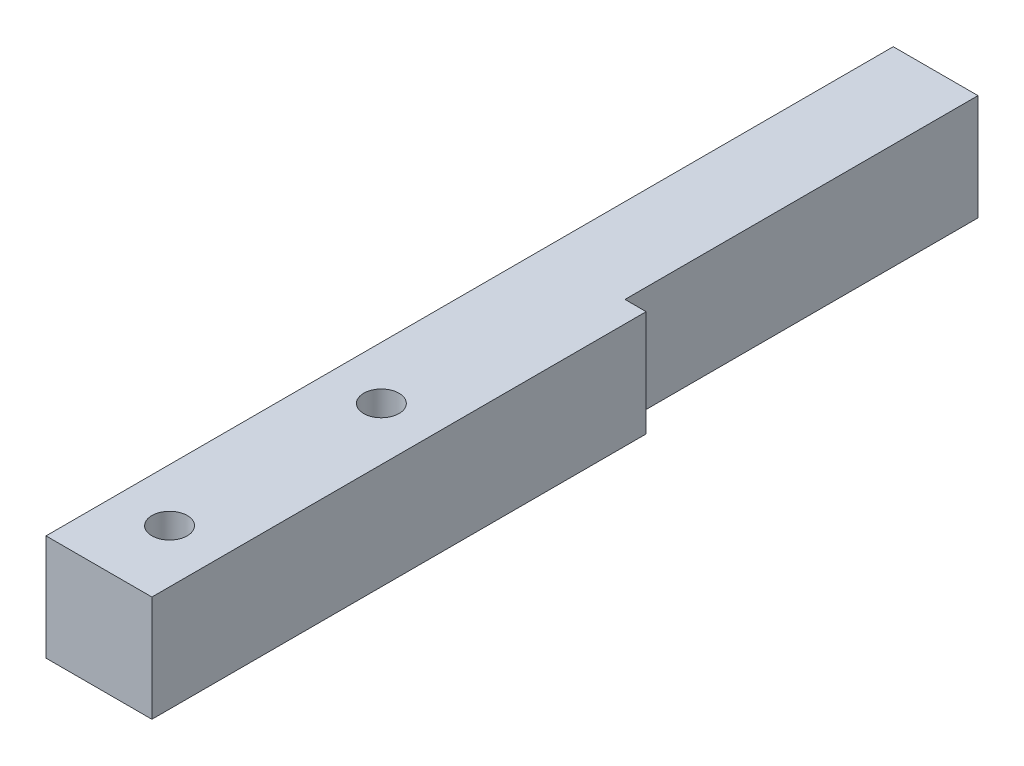
ISO-10303-21;
HEADER;
FILE_DESCRIPTION(('STEP AP214'),'2;1');
FILE_NAME('part.step','',(''),(''),'','','');
FILE_SCHEMA(('AUTOMOTIVE_DESIGN { 1 0 10303 214 1 1 1 1 }'));
ENDSEC;
DATA;
#1=APPLICATION_CONTEXT('core data for automotive mechanical design processes');
#2=APPLICATION_PROTOCOL_DEFINITION('international standard','automotive_design',2000,#1);
#3=PRODUCT_CONTEXT('',#1,'mechanical');
#4=PRODUCT('Part','Part','',(#3));
#5=PRODUCT_RELATED_PRODUCT_CATEGORY('part','',(#4));
#6=PRODUCT_DEFINITION_FORMATION('','',#4);
#7=PRODUCT_DEFINITION_CONTEXT('part definition',#1,'design');
#8=PRODUCT_DEFINITION('design','',#6,#7);
#9=PRODUCT_DEFINITION_SHAPE('','',#8);
#10=(LENGTH_UNIT() NAMED_UNIT(*) SI_UNIT(.MILLI.,.METRE.));
#11=(NAMED_UNIT(*) PLANE_ANGLE_UNIT() SI_UNIT($,.RADIAN.));
#12=(NAMED_UNIT(*) SI_UNIT($,.STERADIAN.) SOLID_ANGLE_UNIT());
#13=UNCERTAINTY_MEASURE_WITH_UNIT(LENGTH_MEASURE(1.E-05),#10,'distance_accuracy_value','');
#14=(GEOMETRIC_REPRESENTATION_CONTEXT(3) GLOBAL_UNCERTAINTY_ASSIGNED_CONTEXT((#13)) GLOBAL_UNIT_ASSIGNED_CONTEXT((#10,
#11,#12)) REPRESENTATION_CONTEXT('',''));
#15=CARTESIAN_POINT('',(0.,0.,0.));
#16=DIRECTION('',(0.,0.,1.));
#17=DIRECTION('',(1.,0.,0.));
#18=AXIS2_PLACEMENT_3D('',#15,#16,#17);
#19=CARTESIAN_POINT('',(9.525,-9.525,152.4));
#20=DIRECTION('',(-1.,0.,0.));
#21=DIRECTION('',(0.,0.,1.));
#22=AXIS2_PLACEMENT_3D('',#19,#20,#21);
#23=PLANE('',#22);
#24=DIRECTION('',(0.,0.,-1.));
#25=VECTOR('',#24,1.);
#26=CARTESIAN_POINT('',(9.525,-9.525,152.4));
#27=LINE('',#26,#25);
#28=CARTESIAN_POINT('',(9.525,-9.525,152.4));
#29=VERTEX_POINT('',#28);
#30=CARTESIAN_POINT('',(9.525,-9.525,63.5));
#31=VERTEX_POINT('',#30);
#32=EDGE_CURVE('E118',#29,#31,#27,.T.);
#33=ORIENTED_EDGE('',*,*,#32,.T.);
#34=DIRECTION('',(0.,-1.,0.));
#35=VECTOR('',#34,1.);
#36=CARTESIAN_POINT('',(9.525,15.875,63.5));
#37=LINE('',#36,#35);
#38=CARTESIAN_POINT('',(9.525,9.525,63.5));
#39=VERTEX_POINT('',#38);
#40=EDGE_CURVE('E102',#39,#31,#37,.T.);
#41=ORIENTED_EDGE('',*,*,#40,.F.);
#42=DIRECTION('',(0.,0.,-1.));
#43=VECTOR('',#42,1.);
#44=CARTESIAN_POINT('',(9.525,9.525,152.4));
#45=LINE('',#44,#43);
#46=CARTESIAN_POINT('',(9.525,9.525,152.4));
#47=VERTEX_POINT('',#46);
#48=EDGE_CURVE('E47',#47,#39,#45,.T.);
#49=ORIENTED_EDGE('',*,*,#48,.F.);
#50=DIRECTION('',(0.,1.,0.));
#51=VECTOR('',#50,1.);
#52=CARTESIAN_POINT('',(9.525,-9.525,152.4));
#53=LINE('',#52,#51);
#54=EDGE_CURVE('E122',#29,#47,#53,.T.);
#55=ORIENTED_EDGE('',*,*,#54,.F.);
#56=EDGE_LOOP('',(#33,#41,#49,#55));
#57=FACE_BOUND('',#56,.T.);
#58=ADVANCED_FACE('F39',(#57),#23,.F.);
#59=CARTESIAN_POINT('',(-9.525,9.525,152.4));
#60=DIRECTION('',(0.,-1.,0.));
#61=DIRECTION('',(0.,0.,-1.));
#62=AXIS2_PLACEMENT_3D('',#59,#60,#61);
#63=PLANE('',#62);
#64=CARTESIAN_POINT('',(0.,9.525,139.7));
#65=DIRECTION('',(0.,-1.,0.));
#66=DIRECTION('',(0.,0.,-1.));
#67=AXIS2_PLACEMENT_3D('',#64,#65,#66);
#68=CIRCLE('',#67,3.175);
#69=CARTESIAN_POINT('',(0.,9.525,136.525));
#70=VERTEX_POINT('',#69);
#71=EDGE_CURVE('E148',#70,#70,#68,.T.);
#72=ORIENTED_EDGE('',*,*,#71,.T.);
#73=EDGE_LOOP('',(#72));
#74=FACE_BOUND('',#73,.T.);
#75=CARTESIAN_POINT('',(0.,9.525,101.6));
#76=DIRECTION('',(0.,-1.,0.));
#77=DIRECTION('',(0.,0.,-1.));
#78=AXIS2_PLACEMENT_3D('',#75,#76,#77);
#79=CIRCLE('',#78,3.175);
#80=CARTESIAN_POINT('',(0.,9.525,98.425));
#81=VERTEX_POINT('',#80);
#82=EDGE_CURVE('E143',#81,#81,#79,.T.);
#83=ORIENTED_EDGE('',*,*,#82,.T.);
#84=EDGE_LOOP('',(#83));
#85=FACE_BOUND('',#84,.T.);
#86=DIRECTION('',(-1.,0.,0.));
#87=VECTOR('',#86,1.);
#88=CARTESIAN_POINT('',(-9.525,9.525,63.5));
#89=LINE('',#88,#87);
#90=CARTESIAN_POINT('',(5.71500000000003,9.525,63.5));
#91=VERTEX_POINT('',#90);
#92=EDGE_CURVE('E108',#39,#91,#89,.T.);
#93=ORIENTED_EDGE('',*,*,#92,.T.);
#94=DIRECTION('',(0.,0.,-1.));
#95=VECTOR('',#94,1.);
#96=CARTESIAN_POINT('',(5.71500000000003,9.525,152.4));
#97=LINE('',#96,#95);
#98=CARTESIAN_POINT('',(5.71500000000003,9.525,0.));
#99=VERTEX_POINT('',#98);
#100=EDGE_CURVE('E140',#91,#99,#97,.T.);
#101=ORIENTED_EDGE('',*,*,#100,.T.);
#102=DIRECTION('',(-1.,0.,0.));
#103=VECTOR('',#102,1.);
#104=CARTESIAN_POINT('',(-9.525,9.525,0.));
#105=LINE('',#104,#103);
#106=CARTESIAN_POINT('',(-9.525,9.525,0.));
#107=VERTEX_POINT('',#106);
#108=EDGE_CURVE('E156',#99,#107,#105,.T.);
#109=ORIENTED_EDGE('',*,*,#108,.T.);
#110=DIRECTION('',(0.,0.,-1.));
#111=VECTOR('',#110,1.);
#112=CARTESIAN_POINT('',(-9.525,9.525,152.4));
#113=LINE('',#112,#111);
#114=CARTESIAN_POINT('',(-9.525,9.525,152.4));
#115=VERTEX_POINT('',#114);
#116=EDGE_CURVE('E128',#115,#107,#113,.T.);
#117=ORIENTED_EDGE('',*,*,#116,.F.);
#118=DIRECTION('',(-1.,0.,0.));
#119=VECTOR('',#118,1.);
#120=CARTESIAN_POINT('',(-9.525,9.525,152.4));
#121=LINE('',#120,#119);
#122=EDGE_CURVE('E86',#47,#115,#121,.T.);
#123=ORIENTED_EDGE('',*,*,#122,.F.);
#124=ORIENTED_EDGE('',*,*,#48,.T.);
#125=EDGE_LOOP('',(#93,#101,#109,#117,#123,#124));
#126=FACE_BOUND('',#125,.T.);
#127=ADVANCED_FACE('F138',(#74,#85,#126),#63,.F.);
#128=CARTESIAN_POINT('',(-9.525,-9.525,152.4));
#129=DIRECTION('',(1.,0.,0.));
#130=DIRECTION('',(0.,0.,-1.));
#131=AXIS2_PLACEMENT_3D('',#128,#129,#130);
#132=PLANE('',#131);
#133=DIRECTION('',(0.,-1.,0.));
#134=VECTOR('',#133,1.);
#135=CARTESIAN_POINT('',(-9.525,-9.525,0.));
#136=LINE('',#135,#134);
#137=CARTESIAN_POINT('',(-9.525,-9.525,0.));
#138=VERTEX_POINT('',#137);
#139=EDGE_CURVE('E78',#107,#138,#136,.T.);
#140=ORIENTED_EDGE('',*,*,#139,.T.);
#141=DIRECTION('',(0.,0.,-1.));
#142=VECTOR('',#141,1.);
#143=CARTESIAN_POINT('',(-9.525,-9.525,152.4));
#144=LINE('',#143,#142);
#145=CARTESIAN_POINT('',(-9.525,-9.525,152.4));
#146=VERTEX_POINT('',#145);
#147=EDGE_CURVE('E124',#146,#138,#144,.T.);
#148=ORIENTED_EDGE('',*,*,#147,.F.);
#149=DIRECTION('',(0.,-1.,0.));
#150=VECTOR('',#149,1.);
#151=CARTESIAN_POINT('',(-9.525,-9.525,152.4));
#152=LINE('',#151,#150);
#153=EDGE_CURVE('E130',#115,#146,#152,.T.);
#154=ORIENTED_EDGE('',*,*,#153,.F.);
#155=ORIENTED_EDGE('',*,*,#116,.T.);
#156=EDGE_LOOP('',(#140,#148,#154,#155));
#157=FACE_BOUND('',#156,.T.);
#158=ADVANCED_FACE('F189',(#157),#132,.F.);
#159=CARTESIAN_POINT('',(-9.525,-9.525,152.4));
#160=DIRECTION('',(0.,1.,0.));
#161=DIRECTION('',(0.,0.,1.));
#162=AXIS2_PLACEMENT_3D('',#159,#160,#161);
#163=PLANE('',#162);
#164=CARTESIAN_POINT('',(0.,-9.525,139.7));
#165=DIRECTION('',(0.,-1.,0.));
#166=DIRECTION('',(0.,0.,-1.));
#167=AXIS2_PLACEMENT_3D('',#164,#165,#166);
#168=CIRCLE('',#167,3.175);
#169=CARTESIAN_POINT('',(0.,-9.525,136.525));
#170=VERTEX_POINT('',#169);
#171=EDGE_CURVE('E150',#170,#170,#168,.T.);
#172=ORIENTED_EDGE('',*,*,#171,.F.);
#173=EDGE_LOOP('',(#172));
#174=FACE_BOUND('',#173,.T.);
#175=CARTESIAN_POINT('',(0.,-9.525,101.6));
#176=DIRECTION('',(0.,-1.,0.));
#177=DIRECTION('',(0.,0.,-1.));
#178=AXIS2_PLACEMENT_3D('',#175,#176,#177);
#179=CIRCLE('',#178,3.175);
#180=CARTESIAN_POINT('',(0.,-9.525,98.425));
#181=VERTEX_POINT('',#180);
#182=EDGE_CURVE('E171',#181,#181,#179,.T.);
#183=ORIENTED_EDGE('',*,*,#182,.F.);
#184=EDGE_LOOP('',(#183));
#185=FACE_BOUND('',#184,.T.);
#186=DIRECTION('',(1.,0.,0.));
#187=VECTOR('',#186,1.);
#188=CARTESIAN_POINT('',(-9.525,-9.525,0.));
#189=LINE('',#188,#187);
#190=CARTESIAN_POINT('',(5.71500000000002,-9.525,0.));
#191=VERTEX_POINT('',#190);
#192=EDGE_CURVE('E133',#138,#191,#189,.T.);
#193=ORIENTED_EDGE('',*,*,#192,.T.);
#194=DIRECTION('',(0.,0.,-1.));
#195=VECTOR('',#194,1.);
#196=CARTESIAN_POINT('',(5.71500000000003,-9.525,63.5));
#197=LINE('',#196,#195);
#198=CARTESIAN_POINT('',(5.71500000000003,-9.525,63.5));
#199=VERTEX_POINT('',#198);
#200=EDGE_CURVE('E53',#199,#191,#197,.T.);
#201=ORIENTED_EDGE('',*,*,#200,.F.);
#202=DIRECTION('',(-1.,0.,0.));
#203=VECTOR('',#202,1.);
#204=CARTESIAN_POINT('',(9.525,-9.525,63.5));
#205=LINE('',#204,#203);
#206=EDGE_CURVE('E106',#31,#199,#205,.T.);
#207=ORIENTED_EDGE('',*,*,#206,.F.);
#208=ORIENTED_EDGE('',*,*,#32,.F.);
#209=DIRECTION('',(1.,0.,0.));
#210=VECTOR('',#209,1.);
#211=CARTESIAN_POINT('',(-9.525,-9.525,152.4));
#212=LINE('',#211,#210);
#213=EDGE_CURVE('E62',#146,#29,#212,.T.);
#214=ORIENTED_EDGE('',*,*,#213,.F.);
#215=ORIENTED_EDGE('',*,*,#147,.T.);
#216=EDGE_LOOP('',(#193,#201,#207,#208,#214,#215));
#217=FACE_BOUND('',#216,.T.);
#218=ADVANCED_FACE('F117',(#174,#185,#217),#163,.F.);
#219=CARTESIAN_POINT('',(0.,0.,152.4));
#220=DIRECTION('',(0.,0.,-1.));
#221=DIRECTION('',(-1.,0.,0.));
#222=AXIS2_PLACEMENT_3D('',#219,#220,#221);
#223=PLANE('',#222);
#224=ORIENTED_EDGE('',*,*,#54,.T.);
#225=ORIENTED_EDGE('',*,*,#122,.T.);
#226=ORIENTED_EDGE('',*,*,#153,.T.);
#227=ORIENTED_EDGE('',*,*,#213,.T.);
#228=EDGE_LOOP('',(#224,#225,#226,#227));
#229=FACE_BOUND('',#228,.T.);
#230=ADVANCED_FACE('F188',(#229),#223,.F.);
#231=CARTESIAN_POINT('',(0.,0.,0.));
#232=DIRECTION('',(0.,0.,-1.));
#233=DIRECTION('',(-1.,0.,0.));
#234=AXIS2_PLACEMENT_3D('',#231,#232,#233);
#235=PLANE('',#234);
#236=DIRECTION('',(0.,1.,0.));
#237=VECTOR('',#236,1.);
#238=CARTESIAN_POINT('',(5.71500000000003,0.,0.));
#239=LINE('',#238,#237);
#240=EDGE_CURVE('E11',#191,#99,#239,.T.);
#241=ORIENTED_EDGE('',*,*,#240,.F.);
#242=ORIENTED_EDGE('',*,*,#192,.F.);
#243=ORIENTED_EDGE('',*,*,#139,.F.);
#244=ORIENTED_EDGE('',*,*,#108,.F.);
#245=EDGE_LOOP('',(#241,#242,#243,#244));
#246=FACE_BOUND('',#245,.T.);
#247=ADVANCED_FACE('F168',(#246),#235,.T.);
#248=CARTESIAN_POINT('',(9.525,15.875,63.5));
#249=DIRECTION('',(0.,0.,1.));
#250=DIRECTION('',(1.,0.,0.));
#251=AXIS2_PLACEMENT_3D('',#248,#249,#250);
#252=PLANE('',#251);
#253=ORIENTED_EDGE('',*,*,#40,.T.);
#254=ORIENTED_EDGE('',*,*,#206,.T.);
#255=DIRECTION('',(0.,-1.,0.));
#256=VECTOR('',#255,1.);
#257=CARTESIAN_POINT('',(5.71500000000003,15.875,63.5));
#258=LINE('',#257,#256);
#259=EDGE_CURVE('E113',#91,#199,#258,.T.);
#260=ORIENTED_EDGE('',*,*,#259,.F.);
#261=ORIENTED_EDGE('',*,*,#92,.F.);
#262=EDGE_LOOP('',(#253,#254,#260,#261));
#263=FACE_BOUND('',#262,.T.);
#264=ADVANCED_FACE('F104',(#263),#252,.F.);
#265=CARTESIAN_POINT('',(5.71500000000003,15.875,63.5));
#266=DIRECTION('',(-1.,0.,0.));
#267=DIRECTION('',(0.,0.,1.));
#268=AXIS2_PLACEMENT_3D('',#265,#266,#267);
#269=PLANE('',#268);
#270=ORIENTED_EDGE('',*,*,#259,.T.);
#271=ORIENTED_EDGE('',*,*,#200,.T.);
#272=ORIENTED_EDGE('',*,*,#240,.T.);
#273=ORIENTED_EDGE('',*,*,#100,.F.);
#274=EDGE_LOOP('',(#270,#271,#272,#273));
#275=FACE_BOUND('',#274,.T.);
#276=ADVANCED_FACE('F169',(#275),#269,.F.);
#277=CARTESIAN_POINT('',(0.,15.875,101.6));
#278=DIRECTION('',(0.,-1.,0.));
#279=DIRECTION('',(0.,0.,-1.));
#280=AXIS2_PLACEMENT_3D('',#277,#278,#279);
#281=CYLINDRICAL_SURFACE('',#280,3.175);
#282=ORIENTED_EDGE('',*,*,#182,.T.);
#283=EDGE_LOOP('',(#282));
#284=FACE_BOUND('',#283,.T.);
#285=ORIENTED_EDGE('',*,*,#82,.F.);
#286=EDGE_LOOP('',(#285));
#287=FACE_BOUND('',#286,.T.);
#288=ADVANCED_FACE('F193',(#284,#287),#281,.F.);
#289=CARTESIAN_POINT('',(0.,15.875,139.7));
#290=DIRECTION('',(0.,-1.,0.));
#291=DIRECTION('',(0.,0.,-1.));
#292=AXIS2_PLACEMENT_3D('',#289,#290,#291);
#293=CYLINDRICAL_SURFACE('',#292,3.175);
#294=ORIENTED_EDGE('',*,*,#171,.T.);
#295=EDGE_LOOP('',(#294));
#296=FACE_BOUND('',#295,.T.);
#297=ORIENTED_EDGE('',*,*,#71,.F.);
#298=EDGE_LOOP('',(#297));
#299=FACE_BOUND('',#298,.T.);
#300=ADVANCED_FACE('F183',(#296,#299),#293,.F.);
#301=CLOSED_SHELL('',(#58,#127,#158,#218,#230,#247,#264,#276,#288,#300));
#302=MANIFOLD_SOLID_BREP('B2',#301);
#303=ADVANCED_BREP_SHAPE_REPRESENTATION('',(#18,#302),#14);
#304=SHAPE_DEFINITION_REPRESENTATION(#9,#303);
ENDSEC;
END-ISO-10303-21;
